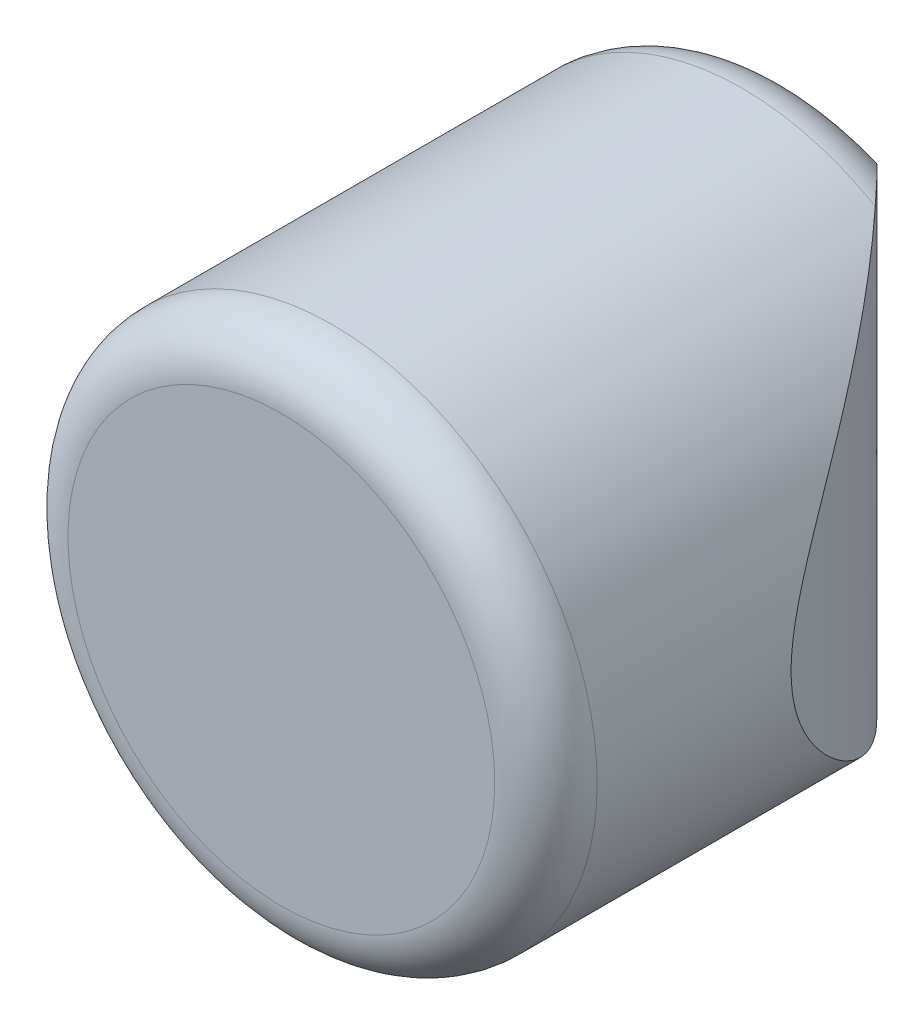
ISO-10303-21;
HEADER;
FILE_DESCRIPTION(('STEP AP214'),'2;1');
FILE_NAME('part.step','',(''),(''),'','','');
FILE_SCHEMA(('AUTOMOTIVE_DESIGN { 1 0 10303 214 1 1 1 1 }'));
ENDSEC;
DATA;
#1=APPLICATION_CONTEXT('core data for automotive mechanical design processes');
#2=APPLICATION_PROTOCOL_DEFINITION('international standard','automotive_design',2000,#1);
#3=PRODUCT_CONTEXT('',#1,'mechanical');
#4=PRODUCT('Part','Part','',(#3));
#5=PRODUCT_RELATED_PRODUCT_CATEGORY('part','',(#4));
#6=PRODUCT_DEFINITION_FORMATION('','',#4);
#7=PRODUCT_DEFINITION_CONTEXT('part definition',#1,'design');
#8=PRODUCT_DEFINITION('design','',#6,#7);
#9=PRODUCT_DEFINITION_SHAPE('','',#8);
#10=(LENGTH_UNIT() NAMED_UNIT(*) SI_UNIT(.MILLI.,.METRE.));
#11=(NAMED_UNIT(*) PLANE_ANGLE_UNIT() SI_UNIT($,.RADIAN.));
#12=(NAMED_UNIT(*) SI_UNIT($,.STERADIAN.) SOLID_ANGLE_UNIT());
#13=UNCERTAINTY_MEASURE_WITH_UNIT(LENGTH_MEASURE(1.E-05),#10,'distance_accuracy_value','');
#14=(GEOMETRIC_REPRESENTATION_CONTEXT(3) GLOBAL_UNCERTAINTY_ASSIGNED_CONTEXT((#13)) GLOBAL_UNIT_ASSIGNED_CONTEXT((#10,
#11,#12)) REPRESENTATION_CONTEXT('',''));
#15=CARTESIAN_POINT('',(0.,0.,0.));
#16=DIRECTION('',(0.,0.,1.));
#17=DIRECTION('',(1.,0.,0.));
#18=AXIS2_PLACEMENT_3D('',#15,#16,#17);
#19=CARTESIAN_POINT('',(0.,0.,30.));
#20=DIRECTION('',(0.,0.,-1.));
#21=DIRECTION('',(-1.,0.,0.));
#22=AXIS2_PLACEMENT_3D('',#19,#20,#21);
#23=CYLINDRICAL_SURFACE('',#22,15.5);
#24=CARTESIAN_POINT('',(0.,0.,27.));
#25=DIRECTION('',(0.,0.,1.));
#26=DIRECTION('',(1.,0.,0.));
#27=AXIS2_PLACEMENT_3D('',#24,#25,#26);
#28=CIRCLE('',#27,15.5);
#29=CARTESIAN_POINT('',(15.5,0.,27.));
#30=VERTEX_POINT('',#29);
#31=EDGE_CURVE('E77',#30,#30,#28,.F.);
#32=ORIENTED_EDGE('',*,*,#31,.T.);
#33=EDGE_LOOP('',(#32));
#34=FACE_BOUND('',#33,.T.);
#35=CARTESIAN_POINT('',(7.79287196314557,13.3985501665673,3.));
#36=CARTESIAN_POINT('',(8.06330587469849,13.2412385678216,3.30430490845591));
#37=CARTESIAN_POINT('',(8.32746720457853,13.0766605359651,3.6103916357061));
#38=CARTESIAN_POINT('',(8.84335966649566,12.7334674149024,4.22562640625889));
#39=CARTESIAN_POINT('',(9.0950813577632,12.5548419232399,4.53477656719116));
#40=CARTESIAN_POINT('',(9.58594899284536,12.1841779651164,5.15536085083208));
#41=CARTESIAN_POINT('',(9.82508746463704,11.9921316833786,5.46679620819877));
#42=CARTESIAN_POINT('',(10.2906815210051,11.5950648040087,6.09106071328898));
#43=CARTESIAN_POINT('',(10.5171331253682,11.3900401772112,6.40389026554692));
#44=CARTESIAN_POINT('',(10.9568653844375,10.967674113247,7.02937127583056));
#45=CARTESIAN_POINT('',(11.1701693960654,10.7503559156296,7.34202201115834));
#46=CARTESIAN_POINT('',(11.5840086656098,10.303085150783,7.96661296435007));
#47=CARTESIAN_POINT('',(11.7845465900307,10.0731352408079,8.27855331738223));
#48=CARTESIAN_POINT('',(12.1727819117027,9.60035990035395,8.90039841923471));
#49=CARTESIAN_POINT('',(12.3604849059024,9.35754016510427,9.21030400137374));
#50=CARTESIAN_POINT('',(12.7229631921691,8.85840426553219,9.82651045062985));
#51=CARTESIAN_POINT('',(12.8977450457249,8.60209506608878,10.1328130799813));
#52=CARTESIAN_POINT('',(13.1870246967534,8.14880105146399,10.6546850024159));
#53=CARTESIAN_POINT('',(13.3046733323744,7.95535777828615,10.8715900863841));
#54=CARTESIAN_POINT('',(13.5330677373009,7.56030057945642,11.3015272838322));
#55=CARTESIAN_POINT('',(13.6438143434307,7.35868764923045,11.5145598645998));
#56=CARTESIAN_POINT('',(13.8584482233254,6.94605121671556,11.9359944095222));
#57=CARTESIAN_POINT('',(13.9623192713225,6.73500729395269,12.1443847002383));
#58=CARTESIAN_POINT('',(14.1625999733299,6.30297251435315,12.5543721364227));
#59=CARTESIAN_POINT('',(14.2590096227175,6.08198165135417,12.7559692776824));
#60=CARTESIAN_POINT('',(14.4447865208532,5.62665161626935,13.1520870442351));
#61=CARTESIAN_POINT('',(14.5340757622456,5.39220312489572,13.3465192882928));
#62=CARTESIAN_POINT('',(14.7038437025162,4.91042107376578,13.7231820316518));
#63=CARTESIAN_POINT('',(14.7843195783822,4.66308342270078,13.9054086141365));
#64=CARTESIAN_POINT('',(14.935092026529,4.15488541554318,14.2527680258537));
#65=CARTESIAN_POINT('',(15.0054211897305,3.89407218254317,14.4179550751243));
#66=CARTESIAN_POINT('',(15.1346280321642,3.35695761711646,14.7260816798025));
#67=CARTESIAN_POINT('',(15.1935168977267,3.08067175794795,14.8690429399944));
#68=CARTESIAN_POINT('',(15.2744643229134,2.63936520347569,15.0679792479928));
#69=CARTESIAN_POINT('',(15.301217578111,2.47982990516447,15.1342672159338));
#70=CARTESIAN_POINT('',(15.350182767653,2.15607958986825,15.2563220925486));
#71=CARTESIAN_POINT('',(15.372395190755,1.99186507870596,15.3120901334971));
#72=CARTESIAN_POINT('',(15.4118190298696,1.65945727062855,15.4115422706712));
#73=CARTESIAN_POINT('',(15.4290375006196,1.49126995299779,15.4552434090505));
#74=CARTESIAN_POINT('',(15.4581086989844,1.1514936846791,15.5292721471333));
#75=CARTESIAN_POINT('',(15.469961511425,0.979904787811491,15.5595999582555));
#76=CARTESIAN_POINT('',(15.4880528928884,0.632964158882021,15.6059709296102));
#77=CARTESIAN_POINT('',(15.4942416252289,0.457592664995811,15.6218872745143));
#78=CARTESIAN_POINT('',(15.5006344037117,0.106020634049295,15.6383293375671));
#79=CARTESIAN_POINT('',(15.5008387064727,-0.0701798671382411,15.6388557156538));
#80=CARTESIAN_POINT('',(15.4952550147494,-0.421931941167621,15.6244929810962));
#81=CARTESIAN_POINT('',(15.4894642585939,-0.597483177518383,15.6095967639116));
#82=CARTESIAN_POINT('',(15.4720674581753,-0.946393033895016,15.5649911737633));
#83=CARTESIAN_POINT('',(15.4604607047221,-1.11975138388135,15.5352799942971));
#84=CARTESIAN_POINT('',(15.4295359216372,-1.48961892712643,15.4564945272894));
#85=CARTESIAN_POINT('',(15.4093033390358,-1.68556521829338,15.4051373173839));
#86=CARTESIAN_POINT('',(15.3621675936653,-2.0716380849605,15.2863667973818));
#87=CARTESIAN_POINT('',(15.335262969564,-2.26176337526372,15.2189499699833));
#88=CARTESIAN_POINT('',(15.2454444956932,-2.82314999249848,14.9958828071977));
#89=CARTESIAN_POINT('',(15.1734754142435,-3.18487065007033,14.8195450176865));
#90=CARTESIAN_POINT('',(15.0559099645928,-3.68709309894297,14.5381337094133));
#91=CARTESIAN_POINT('',(15.0179857144579,-3.83847751122222,14.4481522907084));
#92=CARTESIAN_POINT('',(14.9386752411706,-4.13638702720283,14.2618810874885));
#93=CARTESIAN_POINT('',(14.8972896771099,-4.28291304863555,14.1655925047158));
#94=CARTESIAN_POINT('',(14.7682806707881,-4.71579679645785,13.8686422192794));
#95=CARTESIAN_POINT('',(14.6758527512107,-4.99525962511327,13.6600114681177));
#96=CARTESIAN_POINT('',(14.4794837721606,-5.53879718139934,13.227038342326));
#97=CARTESIAN_POINT('',(14.3755071809813,-5.80282037721762,13.0026483059599));
#98=CARTESIAN_POINT('',(14.157280977024,-6.31658554649837,12.5429947034205));
#99=CARTESIAN_POINT('',(14.0430339161359,-6.5663310424304,12.3077338453272));
#100=CARTESIAN_POINT('',(13.8396980307195,-6.98208462219924,11.8992433173866));
#101=CARTESIAN_POINT('',(13.75301663598,-7.15123108194959,11.7279824419381));
#102=CARTESIAN_POINT('',(13.5749602444106,-7.48371612072488,11.382283310668));
#103=CARTESIAN_POINT('',(13.4835850217145,-7.64705441962066,11.2078449022052));
#104=CARTESIAN_POINT('',(13.2024572229872,-8.12919249988324,10.6805375173206));
#105=CARTESIAN_POINT('',(13.0058125159627,-8.4398922841516,10.3238985799084));
#106=CARTESIAN_POINT('',(12.5946340146561,-9.04201657537668,9.60449084513992));
#107=CARTESIAN_POINT('',(12.3800921071874,-9.33343223189833,9.24171932782275));
#108=CARTESIAN_POINT('',(11.9335796649464,-9.8979318664278,8.5132579865764));
#109=CARTESIAN_POINT('',(11.7016236265346,-10.1710307413362,8.14757081156949));
#110=CARTESIAN_POINT('',(11.220327050343,-10.6996227519002,7.41529742906486));
#111=CARTESIAN_POINT('',(10.9709958275573,-10.9551251772927,7.04871180340849));
#112=CARTESIAN_POINT('',(10.4549687589262,-11.4486254365429,6.31630039411923));
#113=CARTESIAN_POINT('',(10.1882800930666,-11.6866304226208,5.95047436008896));
#114=CARTESIAN_POINT('',(9.58382990941626,-12.1894772647914,5.14983682031553));
#115=CARTESIAN_POINT('',(9.24233224475752,-12.4505378738731,4.71544384185034));
#116=CARTESIAN_POINT('',(8.77086342140579,-12.780553735023,4.14007798629038));
#117=CARTESIAN_POINT('',(8.65186604188972,-12.8614148922922,3.9968069494415));
#118=CARTESIAN_POINT('',(8.41112968127592,-13.0201263475936,3.71087693612779));
#119=CARTESIAN_POINT('',(8.28939055144037,-13.0979764816545,3.5682179933708));
#120=CARTESIAN_POINT('',(8.04317608309905,-13.2505959109181,3.28357729812638));
#121=CARTESIAN_POINT('',(7.91870038755676,-13.3253648004123,3.14159563697935));
#122=CARTESIAN_POINT('',(7.79287196314557,-13.3985501665673,3.));
#123=B_SPLINE_CURVE_WITH_KNOTS('',3,(#35,#36,#37,#38,#39,#40,#41,#42,#43,#44,#45,#46,#47,#48,
#49,#50,#51,#52,#53,#54,#55,#56,#57,#58,#59,#60,#61,#62,#63,#64,#65,#66,#67,#68,#69,#70,#71,#72,
#73,#74,#75,#76,#77,#78,#79,#80,#81,#82,#83,#84,#85,#86,#87,#88,#89,#90,#91,#92,#93,#94,#95,#96,
#97,#98,#99,#100,#101,#102,#103,#104,#105,#106,#107,#108,#109,#110,#111,#112,#113,#114,#115,
#116,#117,#118,#119,#120,#121,#122),.UNSPECIFIED.,.F.,.F.,(4,2,2,2,2,2,2,2,2,2,2,2,2,2,2,2,2,2,
2,2,2,2,2,2,2,2,2,2,2,2,2,2,2,2,2,2,2,2,2,2,2,2,2,4),(0.,1.30918450992181,2.61934779806729,
3.93028049037946,5.24162218078592,6.55056279330992,7.85922909889699,9.1673210441326,
10.4747440977162,11.4151942697571,12.3555301958721,13.2980114649471,14.2404933179142,
15.1921832735647,16.1441771792176,17.0930417782227,18.0409738547063,18.5650649224249,
19.0890995492568,19.6123902489284,20.1356726756088,20.6635162561696,21.191337202208,
21.7194014013684,22.2475300072206,22.8572822590441,23.4671681789193,24.6886245568411,
25.2289724382136,25.7692176616244,26.8504144620949,27.9350350798222,29.0193869442762,
29.7867829017528,30.5542158208789,32.0900807749774,33.6266457931784,35.1619455888754,
36.6964285361695,38.2302807228889,40.0624025295363,40.6714982939839,41.2806271813791,
41.8898360183531),.UNSPECIFIED.);
#124=CARTESIAN_POINT('',(7.79287196314557,13.3985501665673,3.));
#125=VERTEX_POINT('',#124);
#126=CARTESIAN_POINT('',(7.79287196314557,-13.3985501665673,3.));
#127=VERTEX_POINT('',#126);
#128=EDGE_CURVE('E63',#125,#127,#123,.T.);
#129=ORIENTED_EDGE('',*,*,#128,.F.);
#130=CARTESIAN_POINT('',(0.,0.,3.));
#131=DIRECTION('',(0.,0.,1.));
#132=DIRECTION('',(1.,0.,0.));
#133=AXIS2_PLACEMENT_3D('',#130,#131,#132);
#134=CIRCLE('',#133,15.5);
#135=EDGE_CURVE('E80',#125,#127,#134,.T.);
#136=ORIENTED_EDGE('',*,*,#135,.T.);
#137=EDGE_LOOP('',(#129,#136));
#138=FACE_BOUND('',#137,.T.);
#139=ADVANCED_FACE('F37',(#34,#138),#23,.T.);
#140=CARTESIAN_POINT('',(0.,0.,0.));
#141=DIRECTION('',(0.,0.,1.));
#142=DIRECTION('',(1.,0.,0.));
#143=AXIS2_PLACEMENT_3D('',#140,#141,#142);
#144=PLANE('',#143);
#145=DIRECTION('',(0.,-1.,0.));
#146=VECTOR('',#145,1.);
#147=CARTESIAN_POINT('',(4.85419874856241,20.,0.));
#148=LINE('',#147,#146);
#149=CARTESIAN_POINT('',(4.85419874856241,11.5189736743104,0.));
#150=VERTEX_POINT('',#149);
#151=CARTESIAN_POINT('',(4.85419874856241,-11.5189736743104,0.));
#152=VERTEX_POINT('',#151);
#153=EDGE_CURVE('E58',#150,#152,#148,.T.);
#154=ORIENTED_EDGE('',*,*,#153,.T.);
#155=CARTESIAN_POINT('',(0.,0.,0.));
#156=DIRECTION('',(0.,0.,1.));
#157=DIRECTION('',(1.,0.,0.));
#158=AXIS2_PLACEMENT_3D('',#155,#156,#157);
#159=CIRCLE('',#158,12.5);
#160=EDGE_CURVE('E75',#152,#150,#159,.F.);
#161=ORIENTED_EDGE('',*,*,#160,.T.);
#162=EDGE_LOOP('',(#154,#161));
#163=FACE_BOUND('',#162,.T.);
#164=ADVANCED_FACE('F74',(#163),#144,.F.);
#165=CARTESIAN_POINT('',(0.,0.,3.));
#166=DIRECTION('',(0.,0.,1.));
#167=DIRECTION('',(1.,0.,0.));
#168=AXIS2_PLACEMENT_3D('',#165,#166,#167);
#169=TOROIDAL_SURFACE('',#168,12.5,3.);
#170=ORIENTED_EDGE('',*,*,#160,.F.);
#171=CARTESIAN_POINT('',(4.85419874856241,-11.5189736743104,0.));
#172=CARTESIAN_POINT('',(4.85419053742568,-11.5762000150788,-6.6243379211015E-06));
#173=CARTESIAN_POINT('',(4.85569676521444,-11.6334484573167,0.00139026133366471));
#174=CARTESIAN_POINT('',(4.86190790912716,-11.7476656838882,0.00715541479087077));
#175=CARTESIAN_POINT('',(4.86661547471489,-11.8046341971841,0.0115261437647894));
#176=CARTESIAN_POINT('',(4.87940584988092,-11.9179263292349,0.0234096330391995));
#177=CARTESIAN_POINT('',(4.88749191552439,-11.9742492718675,0.0309254244376525));
#178=CARTESIAN_POINT('',(4.90712696589406,-12.0857420116563,0.0491950087267365));
#179=CARTESIAN_POINT('',(4.91867494202825,-12.1409121396723,0.0599478585375089));
#180=CARTESIAN_POINT('',(4.94531268825155,-12.2499242844063,0.0847855927256109));
#181=CARTESIAN_POINT('',(4.96041929849745,-12.3037585978268,0.0988863225126192));
#182=CARTESIAN_POINT('',(4.99407364457972,-12.409381412333,0.130353321181353));
#183=CARTESIAN_POINT('',(5.01262263550269,-12.4611691588636,0.147720781139123));
#184=CARTESIAN_POINT('',(5.05295976811086,-12.5621569263106,0.185564676906599));
#185=CARTESIAN_POINT('',(5.07474135372406,-12.6113619180955,0.206034821865787));
#186=CARTESIAN_POINT('',(5.1213384284374,-12.7069457663038,0.249926835804085));
#187=CARTESIAN_POINT('',(5.14615509179696,-12.7533235184148,0.273349847344071));
#188=CARTESIAN_POINT('',(5.22196314198044,-12.882996458621,0.34508509666157));
#189=CARTESIAN_POINT('',(5.27654743775919,-12.9622975564,0.396953070027357));
#190=CARTESIAN_POINT('',(5.39347041429071,-13.1085567014439,0.508712296098568));
#191=CARTESIAN_POINT('',(5.45581888331844,-13.1754988986029,0.568613683978887));
#192=CARTESIAN_POINT('',(5.60922860715008,-13.3182248231942,0.716964368130932));
#193=CARTESIAN_POINT('',(5.7026510349479,-13.388774817285,0.808022100633197));
#194=CARTESIAN_POINT('',(5.89548651479669,-13.5076855904493,0.99779473697477));
#195=CARTESIAN_POINT('',(5.99490648833968,-13.5560201552828,1.09651852709286));
#196=CARTESIAN_POINT('',(6.22770750631926,-13.6439406614376,1.33002909525111));
#197=CARTESIAN_POINT('',(6.36210359341026,-13.6762276485725,1.46654560777074));
#198=CARTESIAN_POINT('',(6.63110167384026,-13.7096674966261,1.74350239608334));
#199=CARTESIAN_POINT('',(6.76570297103569,-13.7107214187823,1.88395373047268));
#200=CARTESIAN_POINT('',(7.05501440302999,-13.6827816491541,2.189945907555));
#201=CARTESIAN_POINT('',(7.20912416986078,-13.648500448118,2.35557854330179));
#202=CARTESIAN_POINT('',(7.43361747094109,-13.5722354171801,2.60060805581552));
#203=CARTESIAN_POINT('',(7.50706848309888,-13.5428323581588,2.68141222838704));
#204=CARTESIAN_POINT('',(7.65170039246092,-13.4763339626374,2.84172771746459));
#205=CARTESIAN_POINT('',(7.72288344852175,-13.4392462098911,2.92124022586555));
#206=CARTESIAN_POINT('',(7.79287196314557,-13.3985501665673,3.));
#207=B_SPLINE_CURVE_WITH_KNOTS('',3,(#171,#172,#173,#174,#175,#176,#177,#178,#179,#180,#181,
#182,#183,#184,#185,#186,#187,#188,#189,#190,#191,#192,#193,#194,#195,#196,#197,#198,#199,#200,
#201,#202,#203,#204,#205,#206),.UNSPECIFIED.,.F.,.F.,(4,2,2,2,2,2,2,2,2,2,2,2,2,2,2,2,2,4),(0.,
0.171674617749235,0.343491488564649,0.515474333066578,0.687407120749018,0.860170478804718,
1.03299695030157,1.20547758240763,1.37802515894877,1.70457300357262,2.0315367750837,
2.47403096994726,2.91704597649685,3.49672990133644,4.07824992840264,4.76147670092478,
5.1005080158264,5.43920633271837),.UNSPECIFIED.);
#208=EDGE_CURVE('E11',#152,#127,#207,.T.);
#209=ORIENTED_EDGE('',*,*,#208,.T.);
#210=ORIENTED_EDGE('',*,*,#135,.F.);
#211=CARTESIAN_POINT('',(7.79287196314557,13.3985501665673,3.));
#212=CARTESIAN_POINT('',(7.71440013158749,13.4441890606341,2.91168854805139));
#213=CARTESIAN_POINT('',(7.63436498150773,13.4853055619969,2.8223703864506));
#214=CARTESIAN_POINT('',(7.47144222258231,13.5578183588707,2.64211988061358));
#215=CARTESIAN_POINT('',(7.38855015886653,13.5891986327135,2.5511851333783));
#216=CARTESIAN_POINT('',(7.21968726258933,13.6416453595295,2.36756692016447));
#217=CARTESIAN_POINT('',(7.13369536759048,13.6626159805413,2.27487507680827));
#218=CARTESIAN_POINT('',(6.96000924381409,13.69295054396,2.08932309517338));
#219=CARTESIAN_POINT('',(6.8723163497596,13.7023232402575,1.99646313686865));
#220=CARTESIAN_POINT('',(6.65826304765993,13.7098865607743,1.77181492204208));
#221=CARTESIAN_POINT('',(6.53132586234707,13.7016225882524,1.64027435721754));
#222=CARTESIAN_POINT('',(6.27858149136502,13.6566221095573,1.38161423850995));
#223=CARTESIAN_POINT('',(6.15277190759196,13.6199851332041,1.25448085010727));
#224=CARTESIAN_POINT('',(5.93340407225336,13.526590572816,1.03538292364852));
#225=CARTESIAN_POINT('',(5.83882685770784,13.4760125405005,0.941822944173019));
#226=CARTESIAN_POINT('',(5.65582914205583,13.3541194417347,0.762321207806111));
#227=CARTESIAN_POINT('',(5.56740504857166,13.2828166031058,0.6763749976252));
#228=CARTESIAN_POINT('',(5.4153832890097,13.133202992006,0.529707630011373));
#229=CARTESIAN_POINT('',(5.35015437782402,13.0583301135979,0.467208479917106));
#230=CARTESIAN_POINT('',(5.25955533607413,12.9356440882168,0.380852449052443));
#231=CARTESIAN_POINT('',(5.23056731496949,12.8930273448296,0.353303238340423));
#232=CARTESIAN_POINT('',(5.17531149362312,12.8045019389623,0.300917789703368));
#233=CARTESIAN_POINT('',(5.14904257680536,12.7585946409315,0.276080437945997));
#234=CARTESIAN_POINT('',(5.09941420412598,12.6635202422791,0.22925745041855));
#235=CARTESIAN_POINT('',(5.07606887646446,12.6143389481812,0.207285642677234));
#236=CARTESIAN_POINT('',(5.03270509393665,12.5132820316326,0.166548417568091));
#237=CARTESIAN_POINT('',(5.0126852989054,12.4614075056505,0.147781708483085));
#238=CARTESIAN_POINT('',(4.97612804415585,12.355278380012,0.113564525216252));
#239=CARTESIAN_POINT('',(4.95959647838427,12.3010199362474,0.0981196630137528));
#240=CARTESIAN_POINT('',(4.9301680327713,12.1907005160566,0.0706582981913902));
#241=CARTESIAN_POINT('',(4.9172709210071,12.1346396549012,0.0586415768134364));
#242=CARTESIAN_POINT('',(4.88841952458542,11.9867708602119,0.0317814779534135));
#243=CARTESIAN_POINT('',(4.87534475793608,11.8938772222496,0.0196342746282674));
#244=CARTESIAN_POINT('',(4.86251496228735,11.7536422639613,0.00771921800637873));
#245=CARTESIAN_POINT('',(4.85936846991331,11.7068076119394,0.00479821891692304));
#246=CARTESIAN_POINT('',(4.85521099660097,11.6129765103944,0.000939335923999853));
#247=CARTESIAN_POINT('',(4.8541992875998,11.5659801215102,7.75914206085082E-07));
#248=CARTESIAN_POINT('',(4.85419874856241,11.5189736743104,0.));
#249=B_SPLINE_CURVE_WITH_KNOTS('',3,(#211,#212,#213,#214,#215,#216,#217,#218,#219,#220,#221,
#222,#223,#224,#225,#226,#227,#228,#229,#230,#231,#232,#233,#234,#235,#236,#237,#238,#239,#240,
#241,#242,#243,#244,#245,#246,#247,#248),.UNSPECIFIED.,.F.,.F.,(4,2,2,2,2,2,2,2,2,2,2,2,2,2,2,2,
2,2,4),(0.,0.379908748724104,0.760439389128462,1.14441109575678,1.52809281079693,
2.07502500861766,2.62004726243777,3.0454687522303,3.47063974728112,3.82103600394906,
3.99617515599362,4.17124210097929,4.34712483943297,4.52293652558376,4.69904293738474,
4.87513810888783,5.15788925076374,5.29891081318609,5.43988427275542),.UNSPECIFIED.);
#250=EDGE_CURVE('E51',#125,#150,#249,.T.);
#251=ORIENTED_EDGE('',*,*,#250,.T.);
#252=EDGE_LOOP('',(#170,#209,#210,#251));
#253=FACE_BOUND('',#252,.T.);
#254=ADVANCED_FACE('F39',(#253),#169,.T.);
#255=CARTESIAN_POINT('',(0.,0.,30.));
#256=DIRECTION('',(0.,0.,1.));
#257=DIRECTION('',(1.,0.,0.));
#258=AXIS2_PLACEMENT_3D('',#255,#256,#257);
#259=PLANE('',#258);
#260=CARTESIAN_POINT('',(0.,0.,30.));
#261=DIRECTION('',(0.,0.,1.));
#262=DIRECTION('',(1.,0.,0.));
#263=AXIS2_PLACEMENT_3D('',#260,#261,#262);
#264=CIRCLE('',#263,12.5);
#265=CARTESIAN_POINT('',(12.5,0.,30.));
#266=VERTEX_POINT('',#265);
#267=EDGE_CURVE('E109',#266,#266,#264,.T.);
#268=ORIENTED_EDGE('',*,*,#267,.T.);
#269=EDGE_LOOP('',(#268));
#270=FACE_BOUND('',#269,.T.);
#271=ADVANCED_FACE('F92',(#270),#259,.T.);
#272=CARTESIAN_POINT('',(0.,0.,27.));
#273=DIRECTION('',(0.,0.,1.));
#274=DIRECTION('',(1.,0.,0.));
#275=AXIS2_PLACEMENT_3D('',#272,#273,#274);
#276=TOROIDAL_SURFACE('',#275,12.5,3.);
#277=ORIENTED_EDGE('',*,*,#31,.F.);
#278=EDGE_LOOP('',(#277));
#279=FACE_BOUND('',#278,.T.);
#280=ORIENTED_EDGE('',*,*,#267,.F.);
#281=EDGE_LOOP('',(#280));
#282=FACE_BOUND('',#281,.T.);
#283=ADVANCED_FACE('F91',(#279,#282),#276,.T.);
#284=CARTESIAN_POINT('',(4.85419874856241,20.,0.));
#285=CARTESIAN_POINT('',(12.0006595947898,20.,6.63208760566798));
#286=CARTESIAN_POINT('',(15.5,20.,15.6366993120382));
#287=B_SPLINE_CURVE_WITH_KNOTS('',2,(#284,#285,#286),.UNSPECIFIED.,.F.,.F.,(3,3),(0.,1.),.UNSPECIFIED.);
#288=DIRECTION('',(0.,-1.,0.));
#289=VECTOR('',#288,1.);
#290=SURFACE_OF_LINEAR_EXTRUSION('',#287,#289);
#291=ORIENTED_EDGE('',*,*,#153,.F.);
#292=ORIENTED_EDGE('',*,*,#250,.F.);
#293=ORIENTED_EDGE('',*,*,#128,.T.);
#294=ORIENTED_EDGE('',*,*,#208,.F.);
#295=EDGE_LOOP('',(#291,#292,#293,#294));
#296=FACE_BOUND('',#295,.T.);
#297=ADVANCED_FACE('F67',(#296),#290,.T.);
#298=CLOSED_SHELL('',(#139,#164,#254,#271,#283,#297));
#299=MANIFOLD_SOLID_BREP('B2',#298);
#300=ADVANCED_BREP_SHAPE_REPRESENTATION('',(#18,#299),#14);
#301=SHAPE_DEFINITION_REPRESENTATION(#9,#300);
ENDSEC;
END-ISO-10303-21;
